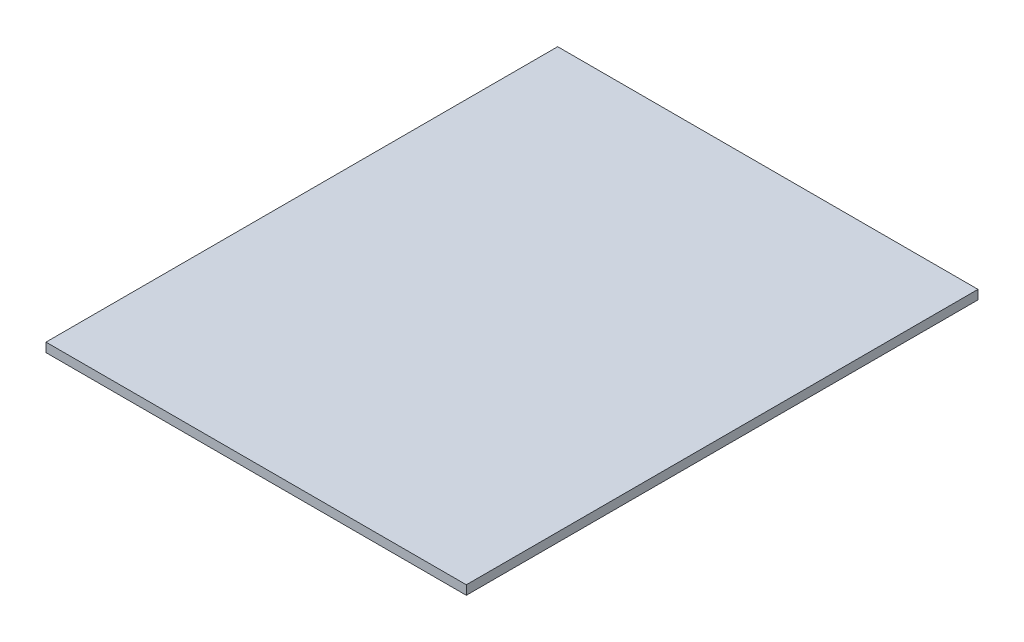
ISO-10303-21;
HEADER;
FILE_DESCRIPTION(('STEP AP214'),'2;1');
FILE_NAME('part.step','',(''),(''),'','','');
FILE_SCHEMA(('AUTOMOTIVE_DESIGN { 1 0 10303 214 1 1 1 1 }'));
ENDSEC;
DATA;
#1=APPLICATION_CONTEXT('core data for automotive mechanical design processes');
#2=APPLICATION_PROTOCOL_DEFINITION('international standard','automotive_design',2000,#1);
#3=PRODUCT_CONTEXT('',#1,'mechanical');
#4=PRODUCT('Part','Part','',(#3));
#5=PRODUCT_RELATED_PRODUCT_CATEGORY('part','',(#4));
#6=PRODUCT_DEFINITION_FORMATION('','',#4);
#7=PRODUCT_DEFINITION_CONTEXT('part definition',#1,'design');
#8=PRODUCT_DEFINITION('design','',#6,#7);
#9=PRODUCT_DEFINITION_SHAPE('','',#8);
#10=(LENGTH_UNIT() NAMED_UNIT(*) SI_UNIT(.MILLI.,.METRE.));
#11=(NAMED_UNIT(*) PLANE_ANGLE_UNIT() SI_UNIT($,.RADIAN.));
#12=(NAMED_UNIT(*) SI_UNIT($,.STERADIAN.) SOLID_ANGLE_UNIT());
#13=UNCERTAINTY_MEASURE_WITH_UNIT(LENGTH_MEASURE(1.E-05),#10,'distance_accuracy_value','');
#14=(GEOMETRIC_REPRESENTATION_CONTEXT(3) GLOBAL_UNCERTAINTY_ASSIGNED_CONTEXT((#13)) GLOBAL_UNIT_ASSIGNED_CONTEXT((#10,
#11,#12)) REPRESENTATION_CONTEXT('',''));
#15=CARTESIAN_POINT('',(0.,0.,0.));
#16=DIRECTION('',(0.,0.,1.));
#17=DIRECTION('',(1.,0.,0.));
#18=AXIS2_PLACEMENT_3D('',#15,#16,#17);
#19=CARTESIAN_POINT('',(-6.22265467978877,5.,1.1058993587818));
#20=DIRECTION('',(1.,0.,0.));
#21=DIRECTION('',(0.,0.,-1.));
#22=AXIS2_PLACEMENT_3D('',#19,#20,#21);
#23=PLANE('',#22);
#24=DIRECTION('',(0.,0.,1.));
#25=VECTOR('',#24,1.);
#26=CARTESIAN_POINT('',(-6.22265467978877,0.,1.1058993587818));
#27=LINE('',#26,#25);
#28=CARTESIAN_POINT('',(-6.22265467978877,0.,-278.894100641218));
#29=VERTEX_POINT('',#28);
#30=CARTESIAN_POINT('',(-6.22265467978877,0.,1.1058993587818));
#31=VERTEX_POINT('',#30);
#32=EDGE_CURVE('E96',#29,#31,#27,.T.);
#33=ORIENTED_EDGE('',*,*,#32,.T.);
#34=DIRECTION('',(0.,-1.,0.));
#35=VECTOR('',#34,1.);
#36=CARTESIAN_POINT('',(-6.22265467978877,5.,1.1058993587818));
#37=LINE('',#36,#35);
#38=CARTESIAN_POINT('',(-6.22265467978877,5.,1.1058993587818));
#39=VERTEX_POINT('',#38);
#40=EDGE_CURVE('E11',#39,#31,#37,.T.);
#41=ORIENTED_EDGE('',*,*,#40,.F.);
#42=DIRECTION('',(0.,0.,1.));
#43=VECTOR('',#42,1.);
#44=CARTESIAN_POINT('',(-6.22265467978877,5.,1.1058993587818));
#45=LINE('',#44,#43);
#46=CARTESIAN_POINT('',(-6.22265467978877,5.,-278.894100641218));
#47=VERTEX_POINT('',#46);
#48=EDGE_CURVE('E84',#47,#39,#45,.T.);
#49=ORIENTED_EDGE('',*,*,#48,.F.);
#50=DIRECTION('',(0.,-1.,0.));
#51=VECTOR('',#50,1.);
#52=CARTESIAN_POINT('',(-6.22265467978877,5.,-278.894100641218));
#53=LINE('',#52,#51);
#54=EDGE_CURVE('E92',#47,#29,#53,.T.);
#55=ORIENTED_EDGE('',*,*,#54,.T.);
#56=EDGE_LOOP('',(#33,#41,#49,#55));
#57=FACE_BOUND('',#56,.T.);
#58=ADVANCED_FACE('F33',(#57),#23,.F.);
#59=CARTESIAN_POINT('',(-6.22265467978877,5.,1.1058993587818));
#60=DIRECTION('',(0.,0.,-1.));
#61=DIRECTION('',(-1.,0.,0.));
#62=AXIS2_PLACEMENT_3D('',#59,#60,#61);
#63=PLANE('',#62);
#64=DIRECTION('',(1.,0.,0.));
#65=VECTOR('',#64,1.);
#66=CARTESIAN_POINT('',(-6.22265467978877,0.,1.1058993587818));
#67=LINE('',#66,#65);
#68=CARTESIAN_POINT('',(223.777345320211,0.,1.1058993587818));
#69=VERTEX_POINT('',#68);
#70=EDGE_CURVE('E88',#31,#69,#67,.T.);
#71=ORIENTED_EDGE('',*,*,#70,.T.);
#72=DIRECTION('',(0.,-1.,0.));
#73=VECTOR('',#72,1.);
#74=CARTESIAN_POINT('',(223.777345320211,5.,1.1058993587818));
#75=LINE('',#74,#73);
#76=CARTESIAN_POINT('',(223.777345320211,5.,1.1058993587818));
#77=VERTEX_POINT('',#76);
#78=EDGE_CURVE('E41',#77,#69,#75,.T.);
#79=ORIENTED_EDGE('',*,*,#78,.F.);
#80=DIRECTION('',(1.,0.,0.));
#81=VECTOR('',#80,1.);
#82=CARTESIAN_POINT('',(-6.22265467978877,5.,1.1058993587818));
#83=LINE('',#82,#81);
#84=EDGE_CURVE('E79',#39,#77,#83,.T.);
#85=ORIENTED_EDGE('',*,*,#84,.F.);
#86=ORIENTED_EDGE('',*,*,#40,.T.);
#87=EDGE_LOOP('',(#71,#79,#85,#86));
#88=FACE_BOUND('',#87,.T.);
#89=ADVANCED_FACE('F87',(#88),#63,.F.);
#90=CARTESIAN_POINT('',(223.777345320211,5.,1.1058993587818));
#91=DIRECTION('',(-1.,0.,0.));
#92=DIRECTION('',(0.,0.,1.));
#93=AXIS2_PLACEMENT_3D('',#90,#91,#92);
#94=PLANE('',#93);
#95=DIRECTION('',(0.,0.,-1.));
#96=VECTOR('',#95,1.);
#97=CARTESIAN_POINT('',(223.777345320211,0.,1.1058993587818));
#98=LINE('',#97,#96);
#99=CARTESIAN_POINT('',(223.777345320211,0.,-278.894100641218));
#100=VERTEX_POINT('',#99);
#101=EDGE_CURVE('E66',#69,#100,#98,.T.);
#102=ORIENTED_EDGE('',*,*,#101,.T.);
#103=DIRECTION('',(0.,-1.,0.));
#104=VECTOR('',#103,1.);
#105=CARTESIAN_POINT('',(223.777345320211,5.,-278.894100641218));
#106=LINE('',#105,#104);
#107=CARTESIAN_POINT('',(223.777345320211,5.,-278.894100641218));
#108=VERTEX_POINT('',#107);
#109=EDGE_CURVE('E89',#108,#100,#106,.T.);
#110=ORIENTED_EDGE('',*,*,#109,.F.);
#111=DIRECTION('',(0.,0.,-1.));
#112=VECTOR('',#111,1.);
#113=CARTESIAN_POINT('',(223.777345320211,5.,1.1058993587818));
#114=LINE('',#113,#112);
#115=EDGE_CURVE('E82',#77,#108,#114,.T.);
#116=ORIENTED_EDGE('',*,*,#115,.F.);
#117=ORIENTED_EDGE('',*,*,#78,.T.);
#118=EDGE_LOOP('',(#102,#110,#116,#117));
#119=FACE_BOUND('',#118,.T.);
#120=ADVANCED_FACE('F90',(#119),#94,.F.);
#121=CARTESIAN_POINT('',(-6.22265467978877,5.,-278.894100641218));
#122=DIRECTION('',(0.,0.,1.));
#123=DIRECTION('',(1.,0.,0.));
#124=AXIS2_PLACEMENT_3D('',#121,#122,#123);
#125=PLANE('',#124);
#126=DIRECTION('',(-1.,0.,0.));
#127=VECTOR('',#126,1.);
#128=CARTESIAN_POINT('',(-6.22265467978877,0.,-278.894100641218));
#129=LINE('',#128,#127);
#130=EDGE_CURVE('E72',#100,#29,#129,.T.);
#131=ORIENTED_EDGE('',*,*,#130,.T.);
#132=ORIENTED_EDGE('',*,*,#54,.F.);
#133=DIRECTION('',(-1.,0.,0.));
#134=VECTOR('',#133,1.);
#135=CARTESIAN_POINT('',(-6.22265467978877,5.,-278.894100641218));
#136=LINE('',#135,#134);
#137=EDGE_CURVE('E49',#108,#47,#136,.T.);
#138=ORIENTED_EDGE('',*,*,#137,.F.);
#139=ORIENTED_EDGE('',*,*,#109,.T.);
#140=EDGE_LOOP('',(#131,#132,#138,#139));
#141=FACE_BOUND('',#140,.T.);
#142=ADVANCED_FACE('F103',(#141),#125,.F.);
#143=CARTESIAN_POINT('',(0.,5.,0.));
#144=DIRECTION('',(0.,-1.,0.));
#145=DIRECTION('',(0.,0.,-1.));
#146=AXIS2_PLACEMENT_3D('',#143,#144,#145);
#147=PLANE('',#146);
#148=ORIENTED_EDGE('',*,*,#48,.T.);
#149=ORIENTED_EDGE('',*,*,#84,.T.);
#150=ORIENTED_EDGE('',*,*,#115,.T.);
#151=ORIENTED_EDGE('',*,*,#137,.T.);
#152=EDGE_LOOP('',(#148,#149,#150,#151));
#153=FACE_BOUND('',#152,.T.);
#154=ADVANCED_FACE('F80',(#153),#147,.F.);
#155=CARTESIAN_POINT('',(0.,0.,0.));
#156=DIRECTION('',(0.,-1.,0.));
#157=DIRECTION('',(0.,0.,-1.));
#158=AXIS2_PLACEMENT_3D('',#155,#156,#157);
#159=PLANE('',#158);
#160=ORIENTED_EDGE('',*,*,#32,.F.);
#161=ORIENTED_EDGE('',*,*,#130,.F.);
#162=ORIENTED_EDGE('',*,*,#101,.F.);
#163=ORIENTED_EDGE('',*,*,#70,.F.);
#164=EDGE_LOOP('',(#160,#161,#162,#163));
#165=FACE_BOUND('',#164,.T.);
#166=ADVANCED_FACE('F106',(#165),#159,.T.);
#167=CLOSED_SHELL('',(#58,#89,#120,#142,#154,#166));
#168=MANIFOLD_SOLID_BREP('B2',#167);
#169=ADVANCED_BREP_SHAPE_REPRESENTATION('',(#18,#168),#14);
#170=SHAPE_DEFINITION_REPRESENTATION(#9,#169);
ENDSEC;
END-ISO-10303-21;
